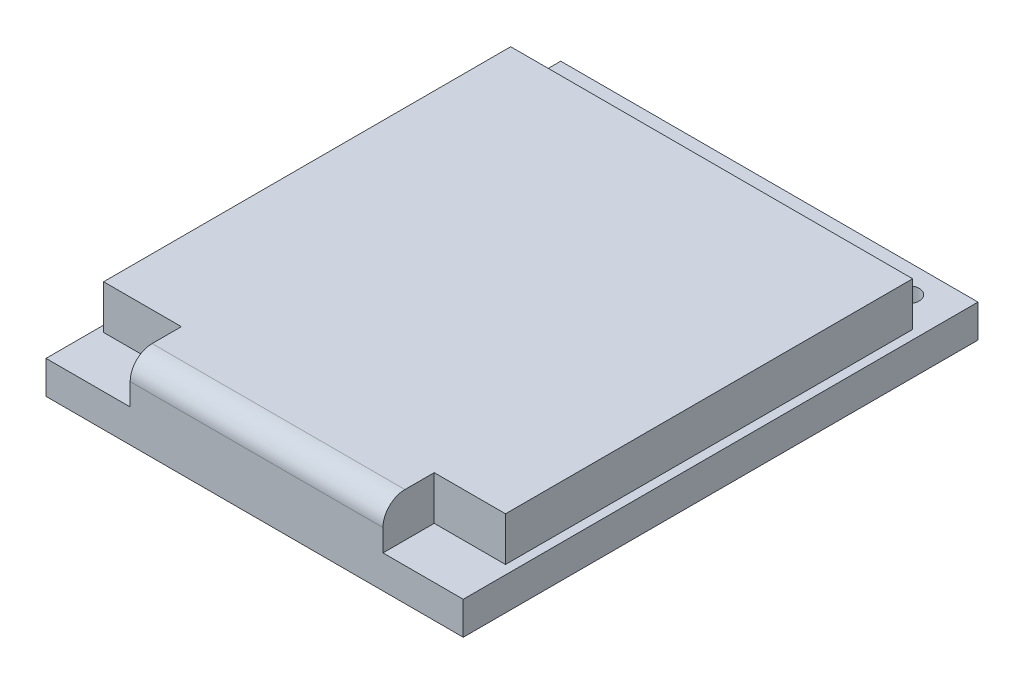
ISO-10303-21;
HEADER;
FILE_DESCRIPTION(('STEP AP214'),'2;1');
FILE_NAME('part.step','',(''),(''),'','','');
FILE_SCHEMA(('AUTOMOTIVE_DESIGN { 1 0 10303 214 1 1 1 1 }'));
ENDSEC;
DATA;
#1=APPLICATION_CONTEXT('core data for automotive mechanical design processes');
#2=APPLICATION_PROTOCOL_DEFINITION('international standard','automotive_design',2000,#1);
#3=PRODUCT_CONTEXT('',#1,'mechanical');
#4=PRODUCT('Part','Part','',(#3));
#5=PRODUCT_RELATED_PRODUCT_CATEGORY('part','',(#4));
#6=PRODUCT_DEFINITION_FORMATION('','',#4);
#7=PRODUCT_DEFINITION_CONTEXT('part definition',#1,'design');
#8=PRODUCT_DEFINITION('design','',#6,#7);
#9=PRODUCT_DEFINITION_SHAPE('','',#8);
#10=(LENGTH_UNIT() NAMED_UNIT(*) SI_UNIT(.MILLI.,.METRE.));
#11=(NAMED_UNIT(*) PLANE_ANGLE_UNIT() SI_UNIT($,.RADIAN.));
#12=(NAMED_UNIT(*) SI_UNIT($,.STERADIAN.) SOLID_ANGLE_UNIT());
#13=UNCERTAINTY_MEASURE_WITH_UNIT(LENGTH_MEASURE(1.E-05),#10,'distance_accuracy_value','');
#14=(GEOMETRIC_REPRESENTATION_CONTEXT(3) GLOBAL_UNCERTAINTY_ASSIGNED_CONTEXT((#13)) GLOBAL_UNIT_ASSIGNED_CONTEXT((#10,
#11,#12)) REPRESENTATION_CONTEXT('',''));
#15=CARTESIAN_POINT('',(0.,0.,0.));
#16=DIRECTION('',(0.,0.,1.));
#17=DIRECTION('',(1.,0.,0.));
#18=AXIS2_PLACEMENT_3D('',#15,#16,#17);
#19=CARTESIAN_POINT('',(0.,1.5,0.));
#20=DIRECTION('',(0.,1.,0.));
#21=DIRECTION('',(0.,0.,1.));
#22=AXIS2_PLACEMENT_3D('',#19,#20,#21);
#23=PLANE('',#22);
#24=DIRECTION('',(0.,0.,-1.));
#25=VECTOR('',#24,1.);
#26=CARTESIAN_POINT('',(15.3447270233196,1.5,21.1069858253315));
#27=LINE('',#26,#25);
#28=CARTESIAN_POINT('',(15.3447270233196,1.5,23.44));
#29=VERTEX_POINT('',#28);
#30=CARTESIAN_POINT('',(15.3447270233196,1.5,21.1069858253315));
#31=VERTEX_POINT('',#30);
#32=EDGE_CURVE('E264',#29,#31,#27,.T.);
#33=ORIENTED_EDGE('',*,*,#32,.F.);
#34=DIRECTION('',(1.,0.,0.));
#35=VECTOR('',#34,1.);
#36=CARTESIAN_POINT('',(0.,1.5,23.44));
#37=LINE('',#36,#35);
#38=CARTESIAN_POINT('',(19.,1.5,23.44));
#39=VERTEX_POINT('',#38);
#40=EDGE_CURVE('E208',#29,#39,#37,.T.);
#41=ORIENTED_EDGE('',*,*,#40,.T.);
#42=DIRECTION('',(0.,0.,-1.));
#43=VECTOR('',#42,1.);
#44=CARTESIAN_POINT('',(19.,1.5,0.));
#45=LINE('',#44,#43);
#46=CARTESIAN_POINT('',(19.,1.5,0.));
#47=VERTEX_POINT('',#46);
#48=EDGE_CURVE('E213',#39,#47,#45,.T.);
#49=ORIENTED_EDGE('',*,*,#48,.T.);
#50=DIRECTION('',(-1.,0.,0.));
#51=VECTOR('',#50,1.);
#52=CARTESIAN_POINT('',(0.,1.5,0.));
#53=LINE('',#52,#51);
#54=CARTESIAN_POINT('',(0.,1.5,0.));
#55=VERTEX_POINT('',#54);
#56=EDGE_CURVE('E215',#47,#55,#53,.T.);
#57=ORIENTED_EDGE('',*,*,#56,.T.);
#58=DIRECTION('',(0.,0.,1.));
#59=VECTOR('',#58,1.);
#60=CARTESIAN_POINT('',(0.,1.5,0.));
#61=LINE('',#60,#59);
#62=CARTESIAN_POINT('',(0.,1.5,23.44));
#63=VERTEX_POINT('',#62);
#64=EDGE_CURVE('E205',#55,#63,#61,.T.);
#65=ORIENTED_EDGE('',*,*,#64,.T.);
#66=CARTESIAN_POINT('',(3.83238591678098,1.5,23.44));
#67=VERTEX_POINT('',#66);
#68=EDGE_CURVE('E210',#63,#67,#37,.T.);
#69=ORIENTED_EDGE('',*,*,#68,.T.);
#70=DIRECTION('',(0.,0.,1.));
#71=VECTOR('',#70,1.);
#72=CARTESIAN_POINT('',(3.83238591678098,1.5,21.1069858253315));
#73=LINE('',#72,#71);
#74=CARTESIAN_POINT('',(3.83238591678098,1.5,21.1069858253315));
#75=VERTEX_POINT('',#74);
#76=EDGE_CURVE('E261',#75,#67,#73,.T.);
#77=ORIENTED_EDGE('',*,*,#76,.F.);
#78=DIRECTION('',(1.,0.,0.));
#79=VECTOR('',#78,1.);
#80=CARTESIAN_POINT('',(0.290127114769082,1.5,21.1069858253315));
#81=LINE('',#80,#79);
#82=CARTESIAN_POINT('',(0.290127114769082,1.5,21.1069858253315));
#83=VERTEX_POINT('',#82);
#84=EDGE_CURVE('E259',#83,#75,#81,.T.);
#85=ORIENTED_EDGE('',*,*,#84,.F.);
#86=DIRECTION('',(0.,0.,1.));
#87=VECTOR('',#86,1.);
#88=CARTESIAN_POINT('',(0.290127114769082,1.5,2.56916476146928));
#89=LINE('',#88,#87);
#90=CARTESIAN_POINT('',(0.290127114769082,1.5,2.56916476146928));
#91=VERTEX_POINT('',#90);
#92=EDGE_CURVE('E156',#91,#83,#89,.T.);
#93=ORIENTED_EDGE('',*,*,#92,.F.);
#94=DIRECTION('',(-1.,0.,0.));
#95=VECTOR('',#94,1.);
#96=CARTESIAN_POINT('',(0.290127114769082,1.5,2.56916476146928));
#97=LINE('',#96,#95);
#98=CARTESIAN_POINT('',(18.5917975918305,1.5,2.56916476146928));
#99=VERTEX_POINT('',#98);
#100=EDGE_CURVE('E153',#99,#91,#97,.T.);
#101=ORIENTED_EDGE('',*,*,#100,.F.);
#102=DIRECTION('',(0.,0.,-1.));
#103=VECTOR('',#102,1.);
#104=CARTESIAN_POINT('',(18.5917975918305,1.5,2.56916476146928));
#105=LINE('',#104,#103);
#106=CARTESIAN_POINT('',(18.5917975918305,1.5,21.1069858253315));
#107=VERTEX_POINT('',#106);
#108=EDGE_CURVE('E269',#107,#99,#105,.T.);
#109=ORIENTED_EDGE('',*,*,#108,.F.);
#110=DIRECTION('',(1.,0.,0.));
#111=VECTOR('',#110,1.);
#112=CARTESIAN_POINT('',(15.3447270233196,1.5,21.1069858253315));
#113=LINE('',#112,#111);
#114=EDGE_CURVE('E266',#31,#107,#113,.T.);
#115=ORIENTED_EDGE('',*,*,#114,.F.);
#116=EDGE_LOOP('',(#33,#41,#49,#57,#65,#69,#77,#85,#93,#101,#109,#115));
#117=FACE_BOUND('',#116,.T.);
#118=CARTESIAN_POINT('',(14.58,1.5,1.3));
#119=DIRECTION('',(0.,1.,0.));
#120=DIRECTION('',(0.,0.,1.));
#121=AXIS2_PLACEMENT_3D('',#118,#119,#120);
#122=CIRCLE('',#121,0.500000000000001);
#123=CARTESIAN_POINT('',(14.58,1.5,1.8));
#124=VERTEX_POINT('',#123);
#125=EDGE_CURVE('E169',#124,#124,#122,.T.);
#126=ORIENTED_EDGE('',*,*,#125,.F.);
#127=EDGE_LOOP('',(#126));
#128=FACE_BOUND('',#127,.T.);
#129=CARTESIAN_POINT('',(9.5,1.5,1.3));
#130=DIRECTION('',(0.,1.,0.));
#131=DIRECTION('',(0.,0.,1.));
#132=AXIS2_PLACEMENT_3D('',#129,#130,#131);
#133=CIRCLE('',#132,0.500000000000001);
#134=CARTESIAN_POINT('',(9.5,1.5,1.8));
#135=VERTEX_POINT('',#134);
#136=EDGE_CURVE('E181',#135,#135,#133,.T.);
#137=ORIENTED_EDGE('',*,*,#136,.F.);
#138=EDGE_LOOP('',(#137));
#139=FACE_BOUND('',#138,.T.);
#140=CARTESIAN_POINT('',(4.42,1.5,1.3));
#141=DIRECTION('',(0.,1.,0.));
#142=DIRECTION('',(0.,0.,1.));
#143=AXIS2_PLACEMENT_3D('',#140,#141,#142);
#144=CIRCLE('',#143,0.500000000000001);
#145=CARTESIAN_POINT('',(4.42,1.5,1.8));
#146=VERTEX_POINT('',#145);
#147=EDGE_CURVE('E193',#146,#146,#144,.T.);
#148=ORIENTED_EDGE('',*,*,#147,.F.);
#149=EDGE_LOOP('',(#148));
#150=FACE_BOUND('',#149,.T.);
#151=CARTESIAN_POINT('',(1.88,1.5,1.3));
#152=DIRECTION('',(0.,1.,0.));
#153=DIRECTION('',(0.,0.,1.));
#154=AXIS2_PLACEMENT_3D('',#151,#152,#153);
#155=CIRCLE('',#154,0.499999999999999);
#156=CARTESIAN_POINT('',(1.88,1.5,1.8));
#157=VERTEX_POINT('',#156);
#158=EDGE_CURVE('E199',#157,#157,#155,.T.);
#159=ORIENTED_EDGE('',*,*,#158,.F.);
#160=EDGE_LOOP('',(#159));
#161=FACE_BOUND('',#160,.T.);
#162=CARTESIAN_POINT('',(6.96,1.5,1.3));
#163=DIRECTION('',(0.,1.,0.));
#164=DIRECTION('',(0.,0.,1.));
#165=AXIS2_PLACEMENT_3D('',#162,#163,#164);
#166=CIRCLE('',#165,0.5);
#167=CARTESIAN_POINT('',(6.96,1.5,1.8));
#168=VERTEX_POINT('',#167);
#169=EDGE_CURVE('E187',#168,#168,#166,.T.);
#170=ORIENTED_EDGE('',*,*,#169,.F.);
#171=EDGE_LOOP('',(#170));
#172=FACE_BOUND('',#171,.T.);
#173=CARTESIAN_POINT('',(12.04,1.5,1.3));
#174=DIRECTION('',(0.,1.,0.));
#175=DIRECTION('',(0.,0.,1.));
#176=AXIS2_PLACEMENT_3D('',#173,#174,#175);
#177=CIRCLE('',#176,0.500000000000001);
#178=CARTESIAN_POINT('',(12.04,1.5,1.8));
#179=VERTEX_POINT('',#178);
#180=EDGE_CURVE('E175',#179,#179,#177,.T.);
#181=ORIENTED_EDGE('',*,*,#180,.F.);
#182=EDGE_LOOP('',(#181));
#183=FACE_BOUND('',#182,.T.);
#184=CARTESIAN_POINT('',(17.12,1.5,1.3));
#185=DIRECTION('',(0.,1.,0.));
#186=DIRECTION('',(0.,0.,1.));
#187=AXIS2_PLACEMENT_3D('',#184,#185,#186);
#188=CIRCLE('',#187,0.499999999999999);
#189=CARTESIAN_POINT('',(17.12,1.5,1.8));
#190=VERTEX_POINT('',#189);
#191=EDGE_CURVE('E160',#190,#190,#188,.T.);
#192=ORIENTED_EDGE('',*,*,#191,.F.);
#193=EDGE_LOOP('',(#192));
#194=FACE_BOUND('',#193,.T.);
#195=ADVANCED_FACE('F38',(#117,#128,#139,#150,#161,#172,#183,#194),#23,.T.);
#196=CARTESIAN_POINT('',(0.,0.,0.));
#197=DIRECTION('',(0.,1.,0.));
#198=DIRECTION('',(0.,0.,1.));
#199=AXIS2_PLACEMENT_3D('',#196,#197,#198);
#200=PLANE('',#199);
#201=DIRECTION('',(0.,0.,1.));
#202=VECTOR('',#201,1.);
#203=CARTESIAN_POINT('',(0.,0.,0.));
#204=LINE('',#203,#202);
#205=CARTESIAN_POINT('',(0.,0.,0.));
#206=VERTEX_POINT('',#205);
#207=CARTESIAN_POINT('',(0.,0.,23.44));
#208=VERTEX_POINT('',#207);
#209=EDGE_CURVE('E202',#206,#208,#204,.T.);
#210=ORIENTED_EDGE('',*,*,#209,.F.);
#211=DIRECTION('',(-1.,0.,0.));
#212=VECTOR('',#211,1.);
#213=CARTESIAN_POINT('',(0.,0.,0.));
#214=LINE('',#213,#212);
#215=CARTESIAN_POINT('',(19.,0.,0.));
#216=VERTEX_POINT('',#215);
#217=EDGE_CURVE('E209',#216,#206,#214,.T.);
#218=ORIENTED_EDGE('',*,*,#217,.F.);
#219=DIRECTION('',(0.,0.,-1.));
#220=VECTOR('',#219,1.);
#221=CARTESIAN_POINT('',(19.,0.,0.));
#222=LINE('',#221,#220);
#223=CARTESIAN_POINT('',(19.,0.,23.44));
#224=VERTEX_POINT('',#223);
#225=EDGE_CURVE('E222',#224,#216,#222,.T.);
#226=ORIENTED_EDGE('',*,*,#225,.F.);
#227=DIRECTION('',(1.,0.,0.));
#228=VECTOR('',#227,1.);
#229=CARTESIAN_POINT('',(0.,0.,23.44));
#230=LINE('',#229,#228);
#231=EDGE_CURVE('E220',#208,#224,#230,.T.);
#232=ORIENTED_EDGE('',*,*,#231,.F.);
#233=EDGE_LOOP('',(#210,#218,#226,#232));
#234=FACE_BOUND('',#233,.T.);
#235=CARTESIAN_POINT('',(1.88,0.,1.3));
#236=DIRECTION('',(0.,1.,0.));
#237=DIRECTION('',(0.,0.,1.));
#238=AXIS2_PLACEMENT_3D('',#235,#236,#237);
#239=CIRCLE('',#238,0.499999999999999);
#240=CARTESIAN_POINT('',(1.88,0.,1.8));
#241=VERTEX_POINT('',#240);
#242=EDGE_CURVE('E196',#241,#241,#239,.T.);
#243=ORIENTED_EDGE('',*,*,#242,.T.);
#244=EDGE_LOOP('',(#243));
#245=FACE_BOUND('',#244,.T.);
#246=CARTESIAN_POINT('',(4.42,0.,1.3));
#247=DIRECTION('',(0.,1.,0.));
#248=DIRECTION('',(0.,0.,1.));
#249=AXIS2_PLACEMENT_3D('',#246,#247,#248);
#250=CIRCLE('',#249,0.500000000000001);
#251=CARTESIAN_POINT('',(4.42,0.,1.8));
#252=VERTEX_POINT('',#251);
#253=EDGE_CURVE('E190',#252,#252,#250,.T.);
#254=ORIENTED_EDGE('',*,*,#253,.T.);
#255=EDGE_LOOP('',(#254));
#256=FACE_BOUND('',#255,.T.);
#257=CARTESIAN_POINT('',(6.96,0.,1.3));
#258=DIRECTION('',(0.,1.,0.));
#259=DIRECTION('',(0.,0.,1.));
#260=AXIS2_PLACEMENT_3D('',#257,#258,#259);
#261=CIRCLE('',#260,0.5);
#262=CARTESIAN_POINT('',(6.96,0.,1.8));
#263=VERTEX_POINT('',#262);
#264=EDGE_CURVE('E184',#263,#263,#261,.T.);
#265=ORIENTED_EDGE('',*,*,#264,.T.);
#266=EDGE_LOOP('',(#265));
#267=FACE_BOUND('',#266,.T.);
#268=CARTESIAN_POINT('',(9.5,0.,1.3));
#269=DIRECTION('',(0.,1.,0.));
#270=DIRECTION('',(0.,0.,1.));
#271=AXIS2_PLACEMENT_3D('',#268,#269,#270);
#272=CIRCLE('',#271,0.500000000000001);
#273=CARTESIAN_POINT('',(9.5,0.,1.8));
#274=VERTEX_POINT('',#273);
#275=EDGE_CURVE('E178',#274,#274,#272,.T.);
#276=ORIENTED_EDGE('',*,*,#275,.T.);
#277=EDGE_LOOP('',(#276));
#278=FACE_BOUND('',#277,.T.);
#279=CARTESIAN_POINT('',(12.04,0.,1.3));
#280=DIRECTION('',(0.,1.,0.));
#281=DIRECTION('',(0.,0.,1.));
#282=AXIS2_PLACEMENT_3D('',#279,#280,#281);
#283=CIRCLE('',#282,0.500000000000001);
#284=CARTESIAN_POINT('',(12.04,0.,1.8));
#285=VERTEX_POINT('',#284);
#286=EDGE_CURVE('E172',#285,#285,#283,.T.);
#287=ORIENTED_EDGE('',*,*,#286,.T.);
#288=EDGE_LOOP('',(#287));
#289=FACE_BOUND('',#288,.T.);
#290=CARTESIAN_POINT('',(14.58,0.,1.3));
#291=DIRECTION('',(0.,1.,0.));
#292=DIRECTION('',(0.,0.,1.));
#293=AXIS2_PLACEMENT_3D('',#290,#291,#292);
#294=CIRCLE('',#293,0.500000000000001);
#295=CARTESIAN_POINT('',(14.58,0.,1.8));
#296=VERTEX_POINT('',#295);
#297=EDGE_CURVE('E167',#296,#296,#294,.T.);
#298=ORIENTED_EDGE('',*,*,#297,.T.);
#299=EDGE_LOOP('',(#298));
#300=FACE_BOUND('',#299,.T.);
#301=CARTESIAN_POINT('',(17.12,0.,1.3));
#302=DIRECTION('',(0.,1.,0.));
#303=DIRECTION('',(0.,0.,1.));
#304=AXIS2_PLACEMENT_3D('',#301,#302,#303);
#305=CIRCLE('',#304,0.499999999999999);
#306=CARTESIAN_POINT('',(17.12,0.,1.8));
#307=VERTEX_POINT('',#306);
#308=EDGE_CURVE('E157',#307,#307,#305,.T.);
#309=ORIENTED_EDGE('',*,*,#308,.T.);
#310=EDGE_LOOP('',(#309));
#311=FACE_BOUND('',#310,.T.);
#312=ADVANCED_FACE('F298',(#234,#245,#256,#267,#278,#289,#300,#311),#200,.F.);
#313=CARTESIAN_POINT('',(0.,1.5,0.));
#314=DIRECTION('',(1.,0.,0.));
#315=DIRECTION('',(0.,0.,-1.));
#316=AXIS2_PLACEMENT_3D('',#313,#314,#315);
#317=PLANE('',#316);
#318=ORIENTED_EDGE('',*,*,#209,.T.);
#319=DIRECTION('',(0.,-1.,0.));
#320=VECTOR('',#319,1.);
#321=CARTESIAN_POINT('',(0.,1.5,23.44));
#322=LINE('',#321,#320);
#323=EDGE_CURVE('E233',#63,#208,#322,.T.);
#324=ORIENTED_EDGE('',*,*,#323,.F.);
#325=ORIENTED_EDGE('',*,*,#64,.F.);
#326=DIRECTION('',(0.,-1.,0.));
#327=VECTOR('',#326,1.);
#328=CARTESIAN_POINT('',(0.,1.5,0.));
#329=LINE('',#328,#327);
#330=EDGE_CURVE('E217',#55,#206,#329,.T.);
#331=ORIENTED_EDGE('',*,*,#330,.T.);
#332=EDGE_LOOP('',(#318,#324,#325,#331));
#333=FACE_BOUND('',#332,.T.);
#334=ADVANCED_FACE('F303',(#333),#317,.F.);
#335=CARTESIAN_POINT('',(0.,1.5,23.44));
#336=DIRECTION('',(0.,0.,-1.));
#337=DIRECTION('',(-1.,0.,0.));
#338=AXIS2_PLACEMENT_3D('',#335,#336,#337);
#339=PLANE('',#338);
#340=DIRECTION('',(0.,-1.,0.));
#341=VECTOR('',#340,1.);
#342=CARTESIAN_POINT('',(15.3447270233196,3.5,23.44));
#343=LINE('',#342,#341);
#344=CARTESIAN_POINT('',(15.3447270233196,2.5,23.44));
#345=VERTEX_POINT('',#344);
#346=EDGE_CURVE('E282',#345,#29,#343,.T.);
#347=ORIENTED_EDGE('',*,*,#346,.F.);
#348=DIRECTION('',(1.,0.,0.));
#349=VECTOR('',#348,1.);
#350=CARTESIAN_POINT('',(3.83238591678098,2.5,23.44));
#351=LINE('',#350,#349);
#352=CARTESIAN_POINT('',(3.83238591678098,2.5,23.44));
#353=VERTEX_POINT('',#352);
#354=EDGE_CURVE('E46',#345,#353,#351,.F.);
#355=ORIENTED_EDGE('',*,*,#354,.T.);
#356=DIRECTION('',(0.,-1.,0.));
#357=VECTOR('',#356,1.);
#358=CARTESIAN_POINT('',(3.83238591678098,3.5,23.44));
#359=LINE('',#358,#357);
#360=EDGE_CURVE('E162',#353,#67,#359,.T.);
#361=ORIENTED_EDGE('',*,*,#360,.T.);
#362=ORIENTED_EDGE('',*,*,#68,.F.);
#363=ORIENTED_EDGE('',*,*,#323,.T.);
#364=ORIENTED_EDGE('',*,*,#231,.T.);
#365=DIRECTION('',(0.,-1.,0.));
#366=VECTOR('',#365,1.);
#367=CARTESIAN_POINT('',(19.,1.5,23.44));
#368=LINE('',#367,#366);
#369=EDGE_CURVE('E230',#39,#224,#368,.T.);
#370=ORIENTED_EDGE('',*,*,#369,.F.);
#371=ORIENTED_EDGE('',*,*,#40,.F.);
#372=EDGE_LOOP('',(#347,#355,#361,#362,#363,#364,#370,#371));
#373=FACE_BOUND('',#372,.T.);
#374=ADVANCED_FACE('F283',(#373),#339,.F.);
#375=CARTESIAN_POINT('',(19.,1.5,0.));
#376=DIRECTION('',(-1.,0.,0.));
#377=DIRECTION('',(0.,0.,1.));
#378=AXIS2_PLACEMENT_3D('',#375,#376,#377);
#379=PLANE('',#378);
#380=ORIENTED_EDGE('',*,*,#225,.T.);
#381=DIRECTION('',(0.,-1.,0.));
#382=VECTOR('',#381,1.);
#383=CARTESIAN_POINT('',(19.,1.5,0.));
#384=LINE('',#383,#382);
#385=EDGE_CURVE('E227',#47,#216,#384,.T.);
#386=ORIENTED_EDGE('',*,*,#385,.F.);
#387=ORIENTED_EDGE('',*,*,#48,.F.);
#388=ORIENTED_EDGE('',*,*,#369,.T.);
#389=EDGE_LOOP('',(#380,#386,#387,#388));
#390=FACE_BOUND('',#389,.T.);
#391=ADVANCED_FACE('F313',(#390),#379,.F.);
#392=CARTESIAN_POINT('',(0.,1.5,0.));
#393=DIRECTION('',(0.,0.,1.));
#394=DIRECTION('',(1.,0.,0.));
#395=AXIS2_PLACEMENT_3D('',#392,#393,#394);
#396=PLANE('',#395);
#397=ORIENTED_EDGE('',*,*,#217,.T.);
#398=ORIENTED_EDGE('',*,*,#330,.F.);
#399=ORIENTED_EDGE('',*,*,#56,.F.);
#400=ORIENTED_EDGE('',*,*,#385,.T.);
#401=EDGE_LOOP('',(#397,#398,#399,#400));
#402=FACE_BOUND('',#401,.T.);
#403=ADVANCED_FACE('F310',(#402),#396,.F.);
#404=CARTESIAN_POINT('',(1.88,1.5,1.3));
#405=DIRECTION('',(0.,-1.,0.));
#406=DIRECTION('',(0.,0.,-1.));
#407=AXIS2_PLACEMENT_3D('',#404,#405,#406);
#408=CYLINDRICAL_SURFACE('',#407,0.499999999999999);
#409=ORIENTED_EDGE('',*,*,#158,.T.);
#410=EDGE_LOOP('',(#409));
#411=FACE_BOUND('',#410,.T.);
#412=ORIENTED_EDGE('',*,*,#242,.F.);
#413=EDGE_LOOP('',(#412));
#414=FACE_BOUND('',#413,.T.);
#415=ADVANCED_FACE('F307',(#411,#414),#408,.F.);
#416=CARTESIAN_POINT('',(4.42,1.5,1.3));
#417=DIRECTION('',(0.,-1.,0.));
#418=DIRECTION('',(0.,0.,-1.));
#419=AXIS2_PLACEMENT_3D('',#416,#417,#418);
#420=CYLINDRICAL_SURFACE('',#419,0.500000000000001);
#421=ORIENTED_EDGE('',*,*,#147,.T.);
#422=EDGE_LOOP('',(#421));
#423=FACE_BOUND('',#422,.T.);
#424=ORIENTED_EDGE('',*,*,#253,.F.);
#425=EDGE_LOOP('',(#424));
#426=FACE_BOUND('',#425,.T.);
#427=ADVANCED_FACE('F376',(#423,#426),#420,.F.);
#428=CARTESIAN_POINT('',(6.96,1.5,1.3));
#429=DIRECTION('',(0.,-1.,0.));
#430=DIRECTION('',(0.,0.,-1.));
#431=AXIS2_PLACEMENT_3D('',#428,#429,#430);
#432=CYLINDRICAL_SURFACE('',#431,0.5);
#433=ORIENTED_EDGE('',*,*,#169,.T.);
#434=EDGE_LOOP('',(#433));
#435=FACE_BOUND('',#434,.T.);
#436=ORIENTED_EDGE('',*,*,#264,.F.);
#437=EDGE_LOOP('',(#436));
#438=FACE_BOUND('',#437,.T.);
#439=ADVANCED_FACE('F373',(#435,#438),#432,.F.);
#440=CARTESIAN_POINT('',(9.5,1.5,1.3));
#441=DIRECTION('',(0.,-1.,0.));
#442=DIRECTION('',(0.,0.,-1.));
#443=AXIS2_PLACEMENT_3D('',#440,#441,#442);
#444=CYLINDRICAL_SURFACE('',#443,0.500000000000001);
#445=ORIENTED_EDGE('',*,*,#136,.T.);
#446=EDGE_LOOP('',(#445));
#447=FACE_BOUND('',#446,.T.);
#448=ORIENTED_EDGE('',*,*,#275,.F.);
#449=EDGE_LOOP('',(#448));
#450=FACE_BOUND('',#449,.T.);
#451=ADVANCED_FACE('F369',(#447,#450),#444,.F.);
#452=CARTESIAN_POINT('',(12.04,1.5,1.3));
#453=DIRECTION('',(0.,-1.,0.));
#454=DIRECTION('',(0.,0.,-1.));
#455=AXIS2_PLACEMENT_3D('',#452,#453,#454);
#456=CYLINDRICAL_SURFACE('',#455,0.500000000000001);
#457=ORIENTED_EDGE('',*,*,#180,.T.);
#458=EDGE_LOOP('',(#457));
#459=FACE_BOUND('',#458,.T.);
#460=ORIENTED_EDGE('',*,*,#286,.F.);
#461=EDGE_LOOP('',(#460));
#462=FACE_BOUND('',#461,.T.);
#463=ADVANCED_FACE('F365',(#459,#462),#456,.F.);
#464=CARTESIAN_POINT('',(14.58,1.5,1.3));
#465=DIRECTION('',(0.,-1.,0.));
#466=DIRECTION('',(0.,0.,-1.));
#467=AXIS2_PLACEMENT_3D('',#464,#465,#466);
#468=CYLINDRICAL_SURFACE('',#467,0.500000000000001);
#469=ORIENTED_EDGE('',*,*,#125,.T.);
#470=EDGE_LOOP('',(#469));
#471=FACE_BOUND('',#470,.T.);
#472=ORIENTED_EDGE('',*,*,#297,.F.);
#473=EDGE_LOOP('',(#472));
#474=FACE_BOUND('',#473,.T.);
#475=ADVANCED_FACE('F361',(#471,#474),#468,.F.);
#476=CARTESIAN_POINT('',(17.12,1.5,1.3));
#477=DIRECTION('',(0.,-1.,0.));
#478=DIRECTION('',(0.,0.,-1.));
#479=AXIS2_PLACEMENT_3D('',#476,#477,#478);
#480=CYLINDRICAL_SURFACE('',#479,0.499999999999999);
#481=ORIENTED_EDGE('',*,*,#191,.T.);
#482=EDGE_LOOP('',(#481));
#483=FACE_BOUND('',#482,.T.);
#484=ORIENTED_EDGE('',*,*,#308,.F.);
#485=EDGE_LOOP('',(#484));
#486=FACE_BOUND('',#485,.T.);
#487=ADVANCED_FACE('F358',(#483,#486),#480,.F.);
#488=CARTESIAN_POINT('',(0.290127114769082,3.5,2.56916476146928));
#489=DIRECTION('',(1.,0.,0.));
#490=DIRECTION('',(0.,0.,-1.));
#491=AXIS2_PLACEMENT_3D('',#488,#489,#490);
#492=PLANE('',#491);
#493=ORIENTED_EDGE('',*,*,#92,.T.);
#494=DIRECTION('',(0.,-1.,0.));
#495=VECTOR('',#494,1.);
#496=CARTESIAN_POINT('',(0.290127114769082,3.5,21.1069858253315));
#497=LINE('',#496,#495);
#498=CARTESIAN_POINT('',(0.290127114769082,3.5,21.1069858253315));
#499=VERTEX_POINT('',#498);
#500=EDGE_CURVE('E136',#499,#83,#497,.T.);
#501=ORIENTED_EDGE('',*,*,#500,.F.);
#502=DIRECTION('',(0.,0.,1.));
#503=VECTOR('',#502,1.);
#504=CARTESIAN_POINT('',(0.290127114769082,3.5,2.56916476146928));
#505=LINE('',#504,#503);
#506=CARTESIAN_POINT('',(0.290127114769082,3.5,2.56916476146928));
#507=VERTEX_POINT('',#506);
#508=EDGE_CURVE('E144',#507,#499,#505,.T.);
#509=ORIENTED_EDGE('',*,*,#508,.F.);
#510=DIRECTION('',(0.,-1.,0.));
#511=VECTOR('',#510,1.);
#512=CARTESIAN_POINT('',(0.290127114769082,3.5,2.56916476146928));
#513=LINE('',#512,#511);
#514=EDGE_CURVE('E257',#507,#91,#513,.T.);
#515=ORIENTED_EDGE('',*,*,#514,.T.);
#516=EDGE_LOOP('',(#493,#501,#509,#515));
#517=FACE_BOUND('',#516,.T.);
#518=ADVANCED_FACE('F155',(#517),#492,.F.);
#519=CARTESIAN_POINT('',(0.290127114769082,3.5,21.1069858253315));
#520=DIRECTION('',(0.,0.,-1.));
#521=DIRECTION('',(-1.,0.,0.));
#522=AXIS2_PLACEMENT_3D('',#519,#520,#521);
#523=PLANE('',#522);
#524=ORIENTED_EDGE('',*,*,#84,.T.);
#525=DIRECTION('',(0.,-1.,0.));
#526=VECTOR('',#525,1.);
#527=CARTESIAN_POINT('',(3.83238591678098,3.5,21.1069858253315));
#528=LINE('',#527,#526);
#529=CARTESIAN_POINT('',(3.83238591678098,3.5,21.1069858253315));
#530=VERTEX_POINT('',#529);
#531=EDGE_CURVE('E139',#530,#75,#528,.T.);
#532=ORIENTED_EDGE('',*,*,#531,.F.);
#533=DIRECTION('',(1.,0.,0.));
#534=VECTOR('',#533,1.);
#535=CARTESIAN_POINT('',(0.290127114769082,3.5,21.1069858253315));
#536=LINE('',#535,#534);
#537=EDGE_CURVE('E131',#499,#530,#536,.T.);
#538=ORIENTED_EDGE('',*,*,#537,.F.);
#539=ORIENTED_EDGE('',*,*,#500,.T.);
#540=EDGE_LOOP('',(#524,#532,#538,#539));
#541=FACE_BOUND('',#540,.T.);
#542=ADVANCED_FACE('F134',(#541),#523,.F.);
#543=CARTESIAN_POINT('',(3.83238591678098,3.5,21.1069858253315));
#544=DIRECTION('',(1.,0.,0.));
#545=DIRECTION('',(0.,0.,-1.));
#546=AXIS2_PLACEMENT_3D('',#543,#544,#545);
#547=PLANE('',#546);
#548=ORIENTED_EDGE('',*,*,#360,.F.);
#549=CARTESIAN_POINT('',(3.83238591678098,2.5,22.44));
#550=DIRECTION('',(1.,0.,0.));
#551=DIRECTION('',(0.,0.,-1.));
#552=AXIS2_PLACEMENT_3D('',#549,#550,#551);
#553=CIRCLE('',#552,1.);
#554=CARTESIAN_POINT('',(3.83238591678098,3.5,22.44));
#555=VERTEX_POINT('',#554);
#556=EDGE_CURVE('E11',#353,#555,#553,.F.);
#557=ORIENTED_EDGE('',*,*,#556,.T.);
#558=DIRECTION('',(0.,0.,1.));
#559=VECTOR('',#558,1.);
#560=CARTESIAN_POINT('',(3.83238591678098,3.5,21.1069858253315));
#561=LINE('',#560,#559);
#562=EDGE_CURVE('E143',#530,#555,#561,.T.);
#563=ORIENTED_EDGE('',*,*,#562,.F.);
#564=ORIENTED_EDGE('',*,*,#531,.T.);
#565=ORIENTED_EDGE('',*,*,#76,.T.);
#566=EDGE_LOOP('',(#548,#557,#563,#564,#565));
#567=FACE_BOUND('',#566,.T.);
#568=ADVANCED_FACE('F290',(#567),#547,.F.);
#569=CARTESIAN_POINT('',(15.3447270233196,3.5,21.1069858253315));
#570=DIRECTION('',(-1.,0.,0.));
#571=DIRECTION('',(0.,0.,1.));
#572=AXIS2_PLACEMENT_3D('',#569,#570,#571);
#573=PLANE('',#572);
#574=DIRECTION('',(0.,0.,-1.));
#575=VECTOR('',#574,1.);
#576=CARTESIAN_POINT('',(15.3447270233196,3.5,21.1069858253315));
#577=LINE('',#576,#575);
#578=CARTESIAN_POINT('',(15.3447270233196,3.5,22.44));
#579=VERTEX_POINT('',#578);
#580=CARTESIAN_POINT('',(15.3447270233196,3.5,21.1069858253315));
#581=VERTEX_POINT('',#580);
#582=EDGE_CURVE('E240',#579,#581,#577,.T.);
#583=ORIENTED_EDGE('',*,*,#582,.F.);
#584=CARTESIAN_POINT('',(15.3447270233196,2.5,22.44));
#585=DIRECTION('',(-1.,0.,0.));
#586=DIRECTION('',(0.,0.,1.));
#587=AXIS2_PLACEMENT_3D('',#584,#585,#586);
#588=CIRCLE('',#587,1.);
#589=EDGE_CURVE('E60',#579,#345,#588,.F.);
#590=ORIENTED_EDGE('',*,*,#589,.T.);
#591=ORIENTED_EDGE('',*,*,#346,.T.);
#592=ORIENTED_EDGE('',*,*,#32,.T.);
#593=DIRECTION('',(0.,-1.,0.));
#594=VECTOR('',#593,1.);
#595=CARTESIAN_POINT('',(15.3447270233196,3.5,21.1069858253315));
#596=LINE('',#595,#594);
#597=EDGE_CURVE('E247',#581,#31,#596,.T.);
#598=ORIENTED_EDGE('',*,*,#597,.F.);
#599=EDGE_LOOP('',(#583,#590,#591,#592,#598));
#600=FACE_BOUND('',#599,.T.);
#601=ADVANCED_FACE('F244',(#600),#573,.F.);
#602=CARTESIAN_POINT('',(15.3447270233196,3.5,21.1069858253315));
#603=DIRECTION('',(0.,0.,-1.));
#604=DIRECTION('',(-1.,0.,0.));
#605=AXIS2_PLACEMENT_3D('',#602,#603,#604);
#606=PLANE('',#605);
#607=ORIENTED_EDGE('',*,*,#114,.T.);
#608=DIRECTION('',(0.,-1.,0.));
#609=VECTOR('',#608,1.);
#610=CARTESIAN_POINT('',(18.5917975918305,3.5,21.1069858253315));
#611=LINE('',#610,#609);
#612=CARTESIAN_POINT('',(18.5917975918305,3.5,21.1069858253315));
#613=VERTEX_POINT('',#612);
#614=EDGE_CURVE('E278',#613,#107,#611,.T.);
#615=ORIENTED_EDGE('',*,*,#614,.F.);
#616=DIRECTION('',(1.,0.,0.));
#617=VECTOR('',#616,1.);
#618=CARTESIAN_POINT('',(15.3447270233196,3.5,21.1069858253315));
#619=LINE('',#618,#617);
#620=EDGE_CURVE('E249',#581,#613,#619,.T.);
#621=ORIENTED_EDGE('',*,*,#620,.F.);
#622=ORIENTED_EDGE('',*,*,#597,.T.);
#623=EDGE_LOOP('',(#607,#615,#621,#622));
#624=FACE_BOUND('',#623,.T.);
#625=ADVANCED_FACE('F334',(#624),#606,.F.);
#626=CARTESIAN_POINT('',(18.5917975918305,3.5,2.56916476146928));
#627=DIRECTION('',(-1.,0.,0.));
#628=DIRECTION('',(0.,0.,1.));
#629=AXIS2_PLACEMENT_3D('',#626,#627,#628);
#630=PLANE('',#629);
#631=ORIENTED_EDGE('',*,*,#108,.T.);
#632=DIRECTION('',(0.,-1.,0.));
#633=VECTOR('',#632,1.);
#634=CARTESIAN_POINT('',(18.5917975918305,3.5,2.56916476146928));
#635=LINE('',#634,#633);
#636=CARTESIAN_POINT('',(18.5917975918305,3.5,2.56916476146928));
#637=VERTEX_POINT('',#636);
#638=EDGE_CURVE('E275',#637,#99,#635,.T.);
#639=ORIENTED_EDGE('',*,*,#638,.F.);
#640=DIRECTION('',(0.,0.,-1.));
#641=VECTOR('',#640,1.);
#642=CARTESIAN_POINT('',(18.5917975918305,3.5,2.56916476146928));
#643=LINE('',#642,#641);
#644=EDGE_CURVE('E251',#613,#637,#643,.T.);
#645=ORIENTED_EDGE('',*,*,#644,.F.);
#646=ORIENTED_EDGE('',*,*,#614,.T.);
#647=EDGE_LOOP('',(#631,#639,#645,#646));
#648=FACE_BOUND('',#647,.T.);
#649=ADVANCED_FACE('F339',(#648),#630,.F.);
#650=CARTESIAN_POINT('',(0.290127114769082,3.5,2.56916476146928));
#651=DIRECTION('',(0.,0.,1.));
#652=DIRECTION('',(1.,0.,0.));
#653=AXIS2_PLACEMENT_3D('',#650,#651,#652);
#654=PLANE('',#653);
#655=ORIENTED_EDGE('',*,*,#100,.T.);
#656=ORIENTED_EDGE('',*,*,#514,.F.);
#657=DIRECTION('',(-1.,0.,0.));
#658=VECTOR('',#657,1.);
#659=CARTESIAN_POINT('',(0.290127114769082,3.5,2.56916476146928));
#660=LINE('',#659,#658);
#661=EDGE_CURVE('E149',#637,#507,#660,.T.);
#662=ORIENTED_EDGE('',*,*,#661,.F.);
#663=ORIENTED_EDGE('',*,*,#638,.T.);
#664=EDGE_LOOP('',(#655,#656,#662,#663));
#665=FACE_BOUND('',#664,.T.);
#666=ADVANCED_FACE('F295',(#665),#654,.F.);
#667=CARTESIAN_POINT('',(0.,3.5,0.));
#668=DIRECTION('',(0.,1.,0.));
#669=DIRECTION('',(0.,0.,1.));
#670=AXIS2_PLACEMENT_3D('',#667,#668,#669);
#671=PLANE('',#670);
#672=ORIENTED_EDGE('',*,*,#562,.T.);
#673=DIRECTION('',(1.,0.,0.));
#674=VECTOR('',#673,1.);
#675=CARTESIAN_POINT('',(15.3447270233196,3.5,22.44));
#676=LINE('',#675,#674);
#677=EDGE_CURVE('E236',#555,#579,#676,.T.);
#678=ORIENTED_EDGE('',*,*,#677,.T.);
#679=ORIENTED_EDGE('',*,*,#582,.T.);
#680=ORIENTED_EDGE('',*,*,#620,.T.);
#681=ORIENTED_EDGE('',*,*,#644,.T.);
#682=ORIENTED_EDGE('',*,*,#661,.T.);
#683=ORIENTED_EDGE('',*,*,#508,.T.);
#684=ORIENTED_EDGE('',*,*,#537,.T.);
#685=EDGE_LOOP('',(#672,#678,#679,#680,#681,#682,#683,#684));
#686=FACE_BOUND('',#685,.T.);
#687=ADVANCED_FACE('F147',(#686),#671,.T.);
#688=CARTESIAN_POINT('',(0.,2.5,22.44));
#689=DIRECTION('',(-1.,0.,0.));
#690=DIRECTION('',(0.,0.,1.));
#691=AXIS2_PLACEMENT_3D('',#688,#689,#690);
#692=CYLINDRICAL_SURFACE('',#691,1.);
#693=ORIENTED_EDGE('',*,*,#556,.F.);
#694=ORIENTED_EDGE('',*,*,#354,.F.);
#695=ORIENTED_EDGE('',*,*,#589,.F.);
#696=ORIENTED_EDGE('',*,*,#677,.F.);
#697=EDGE_LOOP('',(#693,#694,#695,#696));
#698=FACE_BOUND('',#697,.T.);
#699=ADVANCED_FACE('F40',(#698),#692,.T.);
#700=CLOSED_SHELL('',(#195,#312,#334,#374,#391,#403,#415,#427,#439,#451,#463,#475,#487,#518,
#542,#568,#601,#625,#649,#666,#687,#699));
#701=MANIFOLD_SOLID_BREP('B2',#700);
#702=ADVANCED_BREP_SHAPE_REPRESENTATION('',(#18,#701),#14);
#703=SHAPE_DEFINITION_REPRESENTATION(#9,#702);
ENDSEC;
END-ISO-10303-21;
